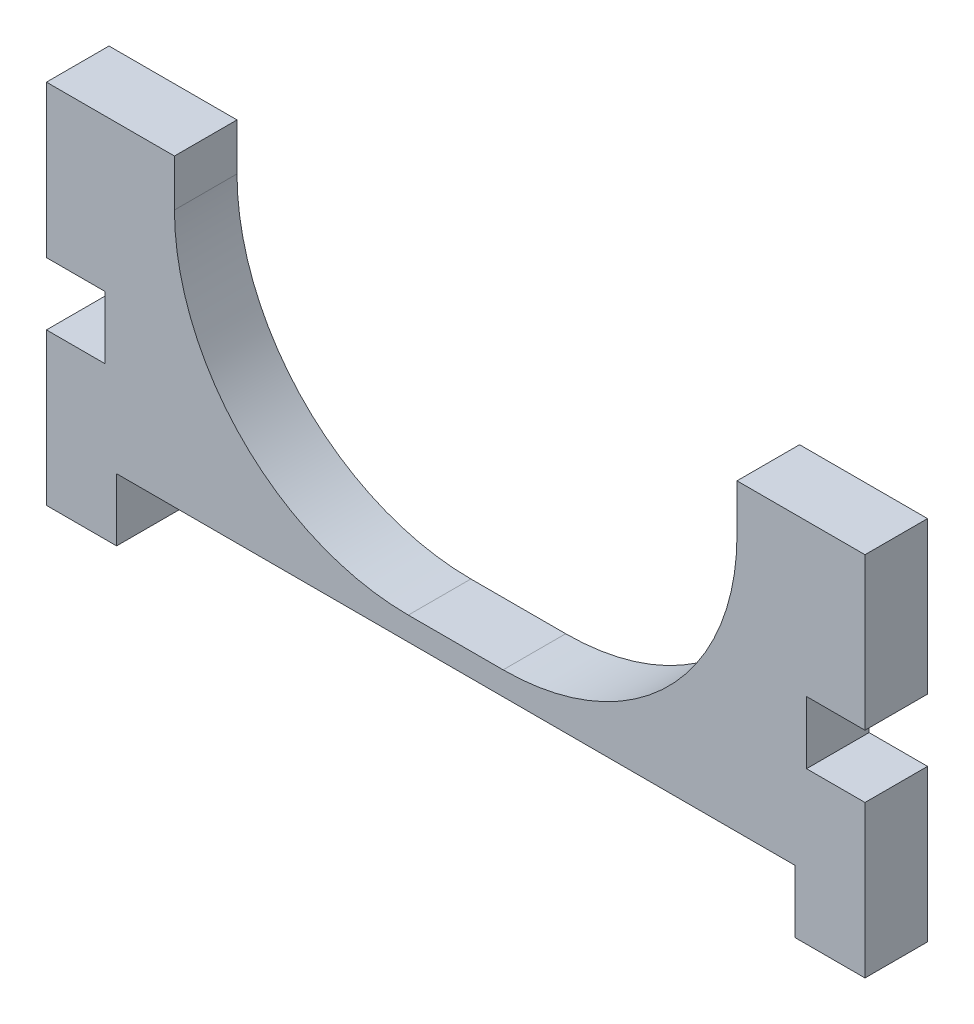
ISO-10303-21;
HEADER;
FILE_DESCRIPTION(('STEP AP214'),'2;1');
FILE_NAME('part.step','',(''),(''),'','','');
FILE_SCHEMA(('AUTOMOTIVE_DESIGN { 1 0 10303 214 1 1 1 1 }'));
ENDSEC;
DATA;
#1=APPLICATION_CONTEXT('core data for automotive mechanical design processes');
#2=APPLICATION_PROTOCOL_DEFINITION('international standard','automotive_design',2000,#1);
#3=PRODUCT_CONTEXT('',#1,'mechanical');
#4=PRODUCT('Part','Part','',(#3));
#5=PRODUCT_RELATED_PRODUCT_CATEGORY('part','',(#4));
#6=PRODUCT_DEFINITION_FORMATION('','',#4);
#7=PRODUCT_DEFINITION_CONTEXT('part definition',#1,'design');
#8=PRODUCT_DEFINITION('design','',#6,#7);
#9=PRODUCT_DEFINITION_SHAPE('','',#8);
#10=(LENGTH_UNIT() NAMED_UNIT(*) SI_UNIT(.MILLI.,.METRE.));
#11=(NAMED_UNIT(*) PLANE_ANGLE_UNIT() SI_UNIT($,.RADIAN.));
#12=(NAMED_UNIT(*) SI_UNIT($,.STERADIAN.) SOLID_ANGLE_UNIT());
#13=UNCERTAINTY_MEASURE_WITH_UNIT(LENGTH_MEASURE(1.E-05),#10,'distance_accuracy_value','');
#14=(GEOMETRIC_REPRESENTATION_CONTEXT(3) GLOBAL_UNCERTAINTY_ASSIGNED_CONTEXT((#13)) GLOBAL_UNIT_ASSIGNED_CONTEXT((#10,
#11,#12)) REPRESENTATION_CONTEXT('',''));
#15=CARTESIAN_POINT('',(0.,0.,0.));
#16=DIRECTION('',(0.,0.,1.));
#17=DIRECTION('',(1.,0.,0.));
#18=AXIS2_PLACEMENT_3D('',#15,#16,#17);
#19=CARTESIAN_POINT('',(-35.,-5.35,5.35));
#20=DIRECTION('',(0.,1.,0.));
#21=DIRECTION('',(0.,0.,1.));
#22=AXIS2_PLACEMENT_3D('',#19,#20,#21);
#23=PLANE('',#22);
#24=DIRECTION('',(1.,0.,0.));
#25=VECTOR('',#24,1.);
#26=CARTESIAN_POINT('',(-35.,-5.35,0.));
#27=LINE('',#26,#25);
#28=CARTESIAN_POINT('',(-35.,-5.35,0.));
#29=VERTEX_POINT('',#28);
#30=CARTESIAN_POINT('',(-29.,-5.35,0.));
#31=VERTEX_POINT('',#30);
#32=EDGE_CURVE('E217',#29,#31,#27,.T.);
#33=ORIENTED_EDGE('',*,*,#32,.T.);
#34=DIRECTION('',(0.,0.,-1.));
#35=VECTOR('',#34,1.);
#36=CARTESIAN_POINT('',(-29.,-5.35,5.35));
#37=LINE('',#36,#35);
#38=CARTESIAN_POINT('',(-29.,-5.35,5.35));
#39=VERTEX_POINT('',#38);
#40=EDGE_CURVE('E41',#39,#31,#37,.T.);
#41=ORIENTED_EDGE('',*,*,#40,.F.);
#42=DIRECTION('',(1.,0.,0.));
#43=VECTOR('',#42,1.);
#44=CARTESIAN_POINT('',(-35.,-5.35,5.35));
#45=LINE('',#44,#43);
#46=CARTESIAN_POINT('',(-35.,-5.35,5.35));
#47=VERTEX_POINT('',#46);
#48=EDGE_CURVE('E135',#47,#39,#45,.T.);
#49=ORIENTED_EDGE('',*,*,#48,.F.);
#50=DIRECTION('',(0.,0.,-1.));
#51=VECTOR('',#50,1.);
#52=CARTESIAN_POINT('',(-35.,-5.35,5.35));
#53=LINE('',#52,#51);
#54=EDGE_CURVE('E11',#47,#29,#53,.T.);
#55=ORIENTED_EDGE('',*,*,#54,.T.);
#56=EDGE_LOOP('',(#33,#41,#49,#55));
#57=FACE_BOUND('',#56,.T.);
#58=ADVANCED_FACE('F33',(#57),#23,.F.);
#59=CARTESIAN_POINT('',(-29.,0.,5.35));
#60=DIRECTION('',(-1.,0.,0.));
#61=DIRECTION('',(0.,0.,1.));
#62=AXIS2_PLACEMENT_3D('',#59,#60,#61);
#63=PLANE('',#62);
#64=DIRECTION('',(0.,1.,0.));
#65=VECTOR('',#64,1.);
#66=CARTESIAN_POINT('',(-29.,0.,0.));
#67=LINE('',#66,#65);
#68=CARTESIAN_POINT('',(-29.,0.,0.));
#69=VERTEX_POINT('',#68);
#70=EDGE_CURVE('E219',#31,#69,#67,.T.);
#71=ORIENTED_EDGE('',*,*,#70,.T.);
#72=DIRECTION('',(0.,0.,-1.));
#73=VECTOR('',#72,1.);
#74=CARTESIAN_POINT('',(-29.,0.,5.35));
#75=LINE('',#74,#73);
#76=CARTESIAN_POINT('',(-29.,0.,5.35));
#77=VERTEX_POINT('',#76);
#78=EDGE_CURVE('E307',#77,#69,#75,.T.);
#79=ORIENTED_EDGE('',*,*,#78,.F.);
#80=DIRECTION('',(0.,1.,0.));
#81=VECTOR('',#80,1.);
#82=CARTESIAN_POINT('',(-29.,0.,5.35));
#83=LINE('',#82,#81);
#84=EDGE_CURVE('E315',#39,#77,#83,.T.);
#85=ORIENTED_EDGE('',*,*,#84,.F.);
#86=ORIENTED_EDGE('',*,*,#40,.T.);
#87=EDGE_LOOP('',(#71,#79,#85,#86));
#88=FACE_BOUND('',#87,.T.);
#89=ADVANCED_FACE('F313',(#88),#63,.F.);
#90=CARTESIAN_POINT('',(-29.,0.,5.35));
#91=DIRECTION('',(0.,1.,0.));
#92=DIRECTION('',(0.,0.,1.));
#93=AXIS2_PLACEMENT_3D('',#90,#91,#92);
#94=PLANE('',#93);
#95=DIRECTION('',(1.,0.,0.));
#96=VECTOR('',#95,1.);
#97=CARTESIAN_POINT('',(-29.,0.,0.));
#98=LINE('',#97,#96);
#99=CARTESIAN_POINT('',(29.,0.,0.));
#100=VERTEX_POINT('',#99);
#101=EDGE_CURVE('E221',#69,#100,#98,.T.);
#102=ORIENTED_EDGE('',*,*,#101,.T.);
#103=DIRECTION('',(0.,0.,-1.));
#104=VECTOR('',#103,1.);
#105=CARTESIAN_POINT('',(29.,0.,5.35));
#106=LINE('',#105,#104);
#107=CARTESIAN_POINT('',(29.,0.,5.35));
#108=VERTEX_POINT('',#107);
#109=EDGE_CURVE('E304',#108,#100,#106,.T.);
#110=ORIENTED_EDGE('',*,*,#109,.F.);
#111=DIRECTION('',(1.,0.,0.));
#112=VECTOR('',#111,1.);
#113=CARTESIAN_POINT('',(-29.,0.,5.35));
#114=LINE('',#113,#112);
#115=EDGE_CURVE('E334',#77,#108,#114,.T.);
#116=ORIENTED_EDGE('',*,*,#115,.F.);
#117=ORIENTED_EDGE('',*,*,#78,.T.);
#118=EDGE_LOOP('',(#102,#110,#116,#117));
#119=FACE_BOUND('',#118,.T.);
#120=ADVANCED_FACE('F325',(#119),#94,.F.);
#121=CARTESIAN_POINT('',(29.,0.,5.35));
#122=DIRECTION('',(1.,0.,0.));
#123=DIRECTION('',(0.,0.,-1.));
#124=AXIS2_PLACEMENT_3D('',#121,#122,#123);
#125=PLANE('',#124);
#126=DIRECTION('',(0.,-1.,0.));
#127=VECTOR('',#126,1.);
#128=CARTESIAN_POINT('',(29.,0.,0.));
#129=LINE('',#128,#127);
#130=CARTESIAN_POINT('',(29.,-5.35,0.));
#131=VERTEX_POINT('',#130);
#132=EDGE_CURVE('E223',#100,#131,#129,.T.);
#133=ORIENTED_EDGE('',*,*,#132,.T.);
#134=DIRECTION('',(0.,0.,-1.));
#135=VECTOR('',#134,1.);
#136=CARTESIAN_POINT('',(29.,-5.35,5.35));
#137=LINE('',#136,#135);
#138=CARTESIAN_POINT('',(29.,-5.35,5.35));
#139=VERTEX_POINT('',#138);
#140=EDGE_CURVE('E301',#139,#131,#137,.T.);
#141=ORIENTED_EDGE('',*,*,#140,.F.);
#142=DIRECTION('',(0.,-1.,0.));
#143=VECTOR('',#142,1.);
#144=CARTESIAN_POINT('',(29.,0.,5.35));
#145=LINE('',#144,#143);
#146=EDGE_CURVE('E331',#108,#139,#145,.T.);
#147=ORIENTED_EDGE('',*,*,#146,.F.);
#148=ORIENTED_EDGE('',*,*,#109,.T.);
#149=EDGE_LOOP('',(#133,#141,#147,#148));
#150=FACE_BOUND('',#149,.T.);
#151=ADVANCED_FACE('F329',(#150),#125,.F.);
#152=CARTESIAN_POINT('',(35.,-5.35,5.35));
#153=DIRECTION('',(0.,1.,0.));
#154=DIRECTION('',(0.,0.,1.));
#155=AXIS2_PLACEMENT_3D('',#152,#153,#154);
#156=PLANE('',#155);
#157=DIRECTION('',(1.,0.,0.));
#158=VECTOR('',#157,1.);
#159=CARTESIAN_POINT('',(35.,-5.35,0.));
#160=LINE('',#159,#158);
#161=CARTESIAN_POINT('',(35.,-5.35,0.));
#162=VERTEX_POINT('',#161);
#163=EDGE_CURVE('E225',#131,#162,#160,.T.);
#164=ORIENTED_EDGE('',*,*,#163,.T.);
#165=DIRECTION('',(0.,0.,-1.));
#166=VECTOR('',#165,1.);
#167=CARTESIAN_POINT('',(35.,-5.35,5.35));
#168=LINE('',#167,#166);
#169=CARTESIAN_POINT('',(35.,-5.35,5.35));
#170=VERTEX_POINT('',#169);
#171=EDGE_CURVE('E298',#170,#162,#168,.T.);
#172=ORIENTED_EDGE('',*,*,#171,.F.);
#173=DIRECTION('',(1.,0.,0.));
#174=VECTOR('',#173,1.);
#175=CARTESIAN_POINT('',(35.,-5.35,5.35));
#176=LINE('',#175,#174);
#177=EDGE_CURVE('E333',#139,#170,#176,.T.);
#178=ORIENTED_EDGE('',*,*,#177,.F.);
#179=ORIENTED_EDGE('',*,*,#140,.T.);
#180=EDGE_LOOP('',(#164,#172,#178,#179));
#181=FACE_BOUND('',#180,.T.);
#182=ADVANCED_FACE('F396',(#181),#156,.F.);
#183=CARTESIAN_POINT('',(35.,-2.50087083037484,5.35));
#184=DIRECTION('',(-1.,0.,0.));
#185=DIRECTION('',(0.,0.,1.));
#186=AXIS2_PLACEMENT_3D('',#183,#184,#185);
#187=PLANE('',#186);
#188=DIRECTION('',(0.,1.,0.));
#189=VECTOR('',#188,1.);
#190=CARTESIAN_POINT('',(35.,-2.50087083037484,0.));
#191=LINE('',#190,#189);
#192=CARTESIAN_POINT('',(35.,7.65,0.));
#193=VERTEX_POINT('',#192);
#194=EDGE_CURVE('E228',#162,#193,#191,.T.);
#195=ORIENTED_EDGE('',*,*,#194,.T.);
#196=DIRECTION('',(0.,0.,-1.));
#197=VECTOR('',#196,1.);
#198=CARTESIAN_POINT('',(35.,7.65,5.35));
#199=LINE('',#198,#197);
#200=CARTESIAN_POINT('',(35.,7.65,5.35));
#201=VERTEX_POINT('',#200);
#202=EDGE_CURVE('E295',#201,#193,#199,.T.);
#203=ORIENTED_EDGE('',*,*,#202,.F.);
#204=DIRECTION('',(0.,1.,0.));
#205=VECTOR('',#204,1.);
#206=CARTESIAN_POINT('',(35.,-2.50087083037484,5.35));
#207=LINE('',#206,#205);
#208=EDGE_CURVE('E336',#170,#201,#207,.T.);
#209=ORIENTED_EDGE('',*,*,#208,.F.);
#210=ORIENTED_EDGE('',*,*,#171,.T.);
#211=EDGE_LOOP('',(#195,#203,#209,#210));
#212=FACE_BOUND('',#211,.T.);
#213=ADVANCED_FACE('F399',(#212),#187,.F.);
#214=CARTESIAN_POINT('',(35.,7.65,5.35));
#215=DIRECTION('',(0.,-1.,0.));
#216=DIRECTION('',(0.,0.,-1.));
#217=AXIS2_PLACEMENT_3D('',#214,#215,#216);
#218=PLANE('',#217);
#219=DIRECTION('',(-1.,0.,0.));
#220=VECTOR('',#219,1.);
#221=CARTESIAN_POINT('',(35.,7.65,0.));
#222=LINE('',#221,#220);
#223=CARTESIAN_POINT('',(30.,7.65,0.));
#224=VERTEX_POINT('',#223);
#225=EDGE_CURVE('E230',#193,#224,#222,.T.);
#226=ORIENTED_EDGE('',*,*,#225,.T.);
#227=DIRECTION('',(0.,0.,-1.));
#228=VECTOR('',#227,1.);
#229=CARTESIAN_POINT('',(30.,7.65,5.35));
#230=LINE('',#229,#228);
#231=CARTESIAN_POINT('',(30.,7.65,5.35));
#232=VERTEX_POINT('',#231);
#233=EDGE_CURVE('E292',#232,#224,#230,.T.);
#234=ORIENTED_EDGE('',*,*,#233,.F.);
#235=DIRECTION('',(-1.,0.,0.));
#236=VECTOR('',#235,1.);
#237=CARTESIAN_POINT('',(35.,7.65,5.35));
#238=LINE('',#237,#236);
#239=EDGE_CURVE('E342',#201,#232,#238,.T.);
#240=ORIENTED_EDGE('',*,*,#239,.F.);
#241=ORIENTED_EDGE('',*,*,#202,.T.);
#242=EDGE_LOOP('',(#226,#234,#240,#241));
#243=FACE_BOUND('',#242,.T.);
#244=ADVANCED_FACE('F403',(#243),#218,.F.);
#245=CARTESIAN_POINT('',(30.,13.,5.35));
#246=DIRECTION('',(-1.,0.,0.));
#247=DIRECTION('',(0.,-1.,0.));
#248=AXIS2_PLACEMENT_3D('',#245,#246,#247);
#249=PLANE('',#248);
#250=DIRECTION('',(0.,1.,0.));
#251=VECTOR('',#250,1.);
#252=CARTESIAN_POINT('',(30.,13.,0.));
#253=LINE('',#252,#251);
#254=CARTESIAN_POINT('',(30.,13.,0.));
#255=VERTEX_POINT('',#254);
#256=EDGE_CURVE('E232',#224,#255,#253,.T.);
#257=ORIENTED_EDGE('',*,*,#256,.T.);
#258=DIRECTION('',(0.,0.,-1.));
#259=VECTOR('',#258,1.);
#260=CARTESIAN_POINT('',(30.,13.,5.35));
#261=LINE('',#260,#259);
#262=CARTESIAN_POINT('',(30.,13.,5.35));
#263=VERTEX_POINT('',#262);
#264=EDGE_CURVE('E289',#263,#255,#261,.T.);
#265=ORIENTED_EDGE('',*,*,#264,.F.);
#266=DIRECTION('',(0.,1.,0.));
#267=VECTOR('',#266,1.);
#268=CARTESIAN_POINT('',(30.,13.,5.35));
#269=LINE('',#268,#267);
#270=EDGE_CURVE('E344',#232,#263,#269,.T.);
#271=ORIENTED_EDGE('',*,*,#270,.F.);
#272=ORIENTED_EDGE('',*,*,#233,.T.);
#273=EDGE_LOOP('',(#257,#265,#271,#272));
#274=FACE_BOUND('',#273,.T.);
#275=ADVANCED_FACE('F407',(#274),#249,.F.);
#276=CARTESIAN_POINT('',(35.,13.,5.35));
#277=DIRECTION('',(0.,1.,0.));
#278=DIRECTION('',(0.,0.,1.));
#279=AXIS2_PLACEMENT_3D('',#276,#277,#278);
#280=PLANE('',#279);
#281=DIRECTION('',(1.,0.,0.));
#282=VECTOR('',#281,1.);
#283=CARTESIAN_POINT('',(35.,13.,0.));
#284=LINE('',#283,#282);
#285=CARTESIAN_POINT('',(35.,13.,0.));
#286=VERTEX_POINT('',#285);
#287=EDGE_CURVE('E234',#255,#286,#284,.T.);
#288=ORIENTED_EDGE('',*,*,#287,.T.);
#289=DIRECTION('',(0.,0.,-1.));
#290=VECTOR('',#289,1.);
#291=CARTESIAN_POINT('',(35.,13.,5.35));
#292=LINE('',#291,#290);
#293=CARTESIAN_POINT('',(35.,13.,5.35));
#294=VERTEX_POINT('',#293);
#295=EDGE_CURVE('E286',#294,#286,#292,.T.);
#296=ORIENTED_EDGE('',*,*,#295,.F.);
#297=DIRECTION('',(1.,0.,0.));
#298=VECTOR('',#297,1.);
#299=CARTESIAN_POINT('',(35.,13.,5.35));
#300=LINE('',#299,#298);
#301=EDGE_CURVE('E346',#263,#294,#300,.T.);
#302=ORIENTED_EDGE('',*,*,#301,.F.);
#303=ORIENTED_EDGE('',*,*,#264,.T.);
#304=EDGE_LOOP('',(#288,#296,#302,#303));
#305=FACE_BOUND('',#304,.T.);
#306=ADVANCED_FACE('F411',(#305),#280,.F.);
#307=CARTESIAN_POINT('',(35.,13.,5.35));
#308=DIRECTION('',(-1.,0.,0.));
#309=DIRECTION('',(0.,0.,1.));
#310=AXIS2_PLACEMENT_3D('',#307,#308,#309);
#311=PLANE('',#310);
#312=DIRECTION('',(0.,1.,0.));
#313=VECTOR('',#312,1.);
#314=CARTESIAN_POINT('',(35.,13.,0.));
#315=LINE('',#314,#313);
#316=CARTESIAN_POINT('',(35.,26.,0.));
#317=VERTEX_POINT('',#316);
#318=EDGE_CURVE('E236',#286,#317,#315,.T.);
#319=ORIENTED_EDGE('',*,*,#318,.T.);
#320=DIRECTION('',(0.,0.,-1.));
#321=VECTOR('',#320,1.);
#322=CARTESIAN_POINT('',(35.,26.,5.35));
#323=LINE('',#322,#321);
#324=CARTESIAN_POINT('',(35.,26.,5.35));
#325=VERTEX_POINT('',#324);
#326=EDGE_CURVE('E283',#325,#317,#323,.T.);
#327=ORIENTED_EDGE('',*,*,#326,.F.);
#328=DIRECTION('',(0.,1.,0.));
#329=VECTOR('',#328,1.);
#330=CARTESIAN_POINT('',(35.,13.,5.35));
#331=LINE('',#330,#329);
#332=EDGE_CURVE('E348',#294,#325,#331,.T.);
#333=ORIENTED_EDGE('',*,*,#332,.F.);
#334=ORIENTED_EDGE('',*,*,#295,.T.);
#335=EDGE_LOOP('',(#319,#327,#333,#334));
#336=FACE_BOUND('',#335,.T.);
#337=ADVANCED_FACE('F415',(#336),#311,.F.);
#338=CARTESIAN_POINT('',(24.055,26.,5.35));
#339=DIRECTION('',(0.,-1.,0.));
#340=DIRECTION('',(1.,0.,0.));
#341=AXIS2_PLACEMENT_3D('',#338,#339,#340);
#342=PLANE('',#341);
#343=DIRECTION('',(-1.,0.,0.));
#344=VECTOR('',#343,1.);
#345=CARTESIAN_POINT('',(24.055,26.,0.));
#346=LINE('',#345,#344);
#347=CARTESIAN_POINT('',(24.055,26.,0.));
#348=VERTEX_POINT('',#347);
#349=EDGE_CURVE('E238',#317,#348,#346,.T.);
#350=ORIENTED_EDGE('',*,*,#349,.T.);
#351=DIRECTION('',(0.,0.,-1.));
#352=VECTOR('',#351,1.);
#353=CARTESIAN_POINT('',(24.055,26.,5.35));
#354=LINE('',#353,#352);
#355=CARTESIAN_POINT('',(24.055,26.,5.35));
#356=VERTEX_POINT('',#355);
#357=EDGE_CURVE('E280',#356,#348,#354,.T.);
#358=ORIENTED_EDGE('',*,*,#357,.F.);
#359=DIRECTION('',(-1.,0.,0.));
#360=VECTOR('',#359,1.);
#361=CARTESIAN_POINT('',(24.055,26.,5.35));
#362=LINE('',#361,#360);
#363=EDGE_CURVE('E350',#325,#356,#362,.T.);
#364=ORIENTED_EDGE('',*,*,#363,.F.);
#365=ORIENTED_EDGE('',*,*,#326,.T.);
#366=EDGE_LOOP('',(#350,#358,#364,#365));
#367=FACE_BOUND('',#366,.T.);
#368=ADVANCED_FACE('F419',(#367),#342,.F.);
#369=CARTESIAN_POINT('',(24.055,26.,5.35));
#370=DIRECTION('',(1.,0.,0.));
#371=DIRECTION('',(0.,0.,-1.));
#372=AXIS2_PLACEMENT_3D('',#369,#370,#371);
#373=PLANE('',#372);
#374=DIRECTION('',(0.,-1.,0.));
#375=VECTOR('',#374,1.);
#376=CARTESIAN_POINT('',(24.055,26.,0.));
#377=LINE('',#376,#375);
#378=CARTESIAN_POINT('',(24.055,22.,0.));
#379=VERTEX_POINT('',#378);
#380=EDGE_CURVE('E240',#348,#379,#377,.T.);
#381=ORIENTED_EDGE('',*,*,#380,.T.);
#382=DIRECTION('',(0.,0.,-1.));
#383=VECTOR('',#382,1.);
#384=CARTESIAN_POINT('',(24.055,22.,5.35));
#385=LINE('',#384,#383);
#386=CARTESIAN_POINT('',(24.055,22.,5.35));
#387=VERTEX_POINT('',#386);
#388=EDGE_CURVE('E277',#387,#379,#385,.T.);
#389=ORIENTED_EDGE('',*,*,#388,.F.);
#390=DIRECTION('',(0.,-1.,0.));
#391=VECTOR('',#390,1.);
#392=CARTESIAN_POINT('',(24.055,26.,5.35));
#393=LINE('',#392,#391);
#394=EDGE_CURVE('E352',#356,#387,#393,.T.);
#395=ORIENTED_EDGE('',*,*,#394,.F.);
#396=ORIENTED_EDGE('',*,*,#357,.T.);
#397=EDGE_LOOP('',(#381,#389,#395,#396));
#398=FACE_BOUND('',#397,.T.);
#399=ADVANCED_FACE('F423',(#398),#373,.F.);
#400=CARTESIAN_POINT('',(4.05500000000001,22.,5.35));
#401=DIRECTION('',(0.,0.,-1.));
#402=DIRECTION('',(-1.,0.,0.));
#403=AXIS2_PLACEMENT_3D('',#400,#401,#402);
#404=CYLINDRICAL_SURFACE('',#403,20.);
#405=CARTESIAN_POINT('',(4.05500000000001,22.,0.));
#406=DIRECTION('',(0.,0.,-1.));
#407=DIRECTION('',(-1.,0.,0.));
#408=AXIS2_PLACEMENT_3D('',#405,#406,#407);
#409=CIRCLE('',#408,20.);
#410=CARTESIAN_POINT('',(4.05500000000001,2.,0.));
#411=VERTEX_POINT('',#410);
#412=EDGE_CURVE('E242',#379,#411,#409,.T.);
#413=ORIENTED_EDGE('',*,*,#412,.T.);
#414=DIRECTION('',(0.,0.,-1.));
#415=VECTOR('',#414,1.);
#416=CARTESIAN_POINT('',(4.05500000000001,2.,5.35));
#417=LINE('',#416,#415);
#418=CARTESIAN_POINT('',(4.05500000000001,2.,5.35));
#419=VERTEX_POINT('',#418);
#420=EDGE_CURVE('E274',#419,#411,#417,.T.);
#421=ORIENTED_EDGE('',*,*,#420,.F.);
#422=CARTESIAN_POINT('',(4.05500000000001,22.,5.35));
#423=DIRECTION('',(0.,0.,-1.));
#424=DIRECTION('',(-1.,0.,0.));
#425=AXIS2_PLACEMENT_3D('',#422,#423,#424);
#426=CIRCLE('',#425,20.);
#427=EDGE_CURVE('E354',#387,#419,#426,.T.);
#428=ORIENTED_EDGE('',*,*,#427,.F.);
#429=ORIENTED_EDGE('',*,*,#388,.T.);
#430=EDGE_LOOP('',(#413,#421,#428,#429));
#431=FACE_BOUND('',#430,.T.);
#432=ADVANCED_FACE('F427',(#431),#404,.F.);
#433=CARTESIAN_POINT('',(-4.05500000000001,2.,5.35));
#434=DIRECTION('',(0.,-1.,0.));
#435=DIRECTION('',(0.,0.,-1.));
#436=AXIS2_PLACEMENT_3D('',#433,#434,#435);
#437=PLANE('',#436);
#438=DIRECTION('',(-1.,0.,0.));
#439=VECTOR('',#438,1.);
#440=CARTESIAN_POINT('',(-4.05500000000001,2.,0.));
#441=LINE('',#440,#439);
#442=CARTESIAN_POINT('',(-4.05500000000001,2.,0.));
#443=VERTEX_POINT('',#442);
#444=EDGE_CURVE('E244',#411,#443,#441,.T.);
#445=ORIENTED_EDGE('',*,*,#444,.T.);
#446=DIRECTION('',(0.,0.,-1.));
#447=VECTOR('',#446,1.);
#448=CARTESIAN_POINT('',(-4.05500000000001,2.,5.35));
#449=LINE('',#448,#447);
#450=CARTESIAN_POINT('',(-4.05500000000001,2.,5.35));
#451=VERTEX_POINT('',#450);
#452=EDGE_CURVE('E271',#451,#443,#449,.T.);
#453=ORIENTED_EDGE('',*,*,#452,.F.);
#454=DIRECTION('',(-1.,0.,0.));
#455=VECTOR('',#454,1.);
#456=CARTESIAN_POINT('',(-4.05500000000001,2.,5.35));
#457=LINE('',#456,#455);
#458=EDGE_CURVE('E356',#419,#451,#457,.T.);
#459=ORIENTED_EDGE('',*,*,#458,.F.);
#460=ORIENTED_EDGE('',*,*,#420,.T.);
#461=EDGE_LOOP('',(#445,#453,#459,#460));
#462=FACE_BOUND('',#461,.T.);
#463=ADVANCED_FACE('F431',(#462),#437,.F.);
#464=CARTESIAN_POINT('',(-4.05500000000001,22.,5.35));
#465=DIRECTION('',(0.,0.,-1.));
#466=DIRECTION('',(-1.,0.,0.));
#467=AXIS2_PLACEMENT_3D('',#464,#465,#466);
#468=CYLINDRICAL_SURFACE('',#467,20.);
#469=CARTESIAN_POINT('',(-4.05500000000001,22.,0.));
#470=DIRECTION('',(0.,0.,-1.));
#471=DIRECTION('',(1.,0.,0.));
#472=AXIS2_PLACEMENT_3D('',#469,#470,#471);
#473=CIRCLE('',#472,20.);
#474=CARTESIAN_POINT('',(-24.055,22.,0.));
#475=VERTEX_POINT('',#474);
#476=EDGE_CURVE('E246',#443,#475,#473,.T.);
#477=ORIENTED_EDGE('',*,*,#476,.T.);
#478=DIRECTION('',(0.,0.,-1.));
#479=VECTOR('',#478,1.);
#480=CARTESIAN_POINT('',(-24.055,22.,5.35));
#481=LINE('',#480,#479);
#482=CARTESIAN_POINT('',(-24.055,22.,5.35));
#483=VERTEX_POINT('',#482);
#484=EDGE_CURVE('E268',#483,#475,#481,.T.);
#485=ORIENTED_EDGE('',*,*,#484,.F.);
#486=CARTESIAN_POINT('',(-4.05500000000001,22.,5.35));
#487=DIRECTION('',(0.,0.,-1.));
#488=DIRECTION('',(1.,0.,0.));
#489=AXIS2_PLACEMENT_3D('',#486,#487,#488);
#490=CIRCLE('',#489,20.);
#491=EDGE_CURVE('E358',#451,#483,#490,.T.);
#492=ORIENTED_EDGE('',*,*,#491,.F.);
#493=ORIENTED_EDGE('',*,*,#452,.T.);
#494=EDGE_LOOP('',(#477,#485,#492,#493));
#495=FACE_BOUND('',#494,.T.);
#496=ADVANCED_FACE('F435',(#495),#468,.F.);
#497=CARTESIAN_POINT('',(-24.055,26.,5.35));
#498=DIRECTION('',(-1.,0.,0.));
#499=DIRECTION('',(0.,0.,1.));
#500=AXIS2_PLACEMENT_3D('',#497,#498,#499);
#501=PLANE('',#500);
#502=DIRECTION('',(0.,1.,0.));
#503=VECTOR('',#502,1.);
#504=CARTESIAN_POINT('',(-24.055,26.,0.));
#505=LINE('',#504,#503);
#506=CARTESIAN_POINT('',(-24.055,26.,0.));
#507=VERTEX_POINT('',#506);
#508=EDGE_CURVE('E248',#475,#507,#505,.T.);
#509=ORIENTED_EDGE('',*,*,#508,.T.);
#510=DIRECTION('',(0.,0.,-1.));
#511=VECTOR('',#510,1.);
#512=CARTESIAN_POINT('',(-24.055,26.,5.35));
#513=LINE('',#512,#511);
#514=CARTESIAN_POINT('',(-24.055,26.,5.35));
#515=VERTEX_POINT('',#514);
#516=EDGE_CURVE('E265',#515,#507,#513,.T.);
#517=ORIENTED_EDGE('',*,*,#516,.F.);
#518=DIRECTION('',(0.,1.,0.));
#519=VECTOR('',#518,1.);
#520=CARTESIAN_POINT('',(-24.055,26.,5.35));
#521=LINE('',#520,#519);
#522=EDGE_CURVE('E360',#483,#515,#521,.T.);
#523=ORIENTED_EDGE('',*,*,#522,.F.);
#524=ORIENTED_EDGE('',*,*,#484,.T.);
#525=EDGE_LOOP('',(#509,#517,#523,#524));
#526=FACE_BOUND('',#525,.T.);
#527=ADVANCED_FACE('F439',(#526),#501,.F.);
#528=CARTESIAN_POINT('',(-35.,26.,5.35));
#529=DIRECTION('',(0.,-1.,0.));
#530=DIRECTION('',(1.,0.,0.));
#531=AXIS2_PLACEMENT_3D('',#528,#529,#530);
#532=PLANE('',#531);
#533=DIRECTION('',(-1.,0.,0.));
#534=VECTOR('',#533,1.);
#535=CARTESIAN_POINT('',(-35.,26.,0.));
#536=LINE('',#535,#534);
#537=CARTESIAN_POINT('',(-35.,26.,0.));
#538=VERTEX_POINT('',#537);
#539=EDGE_CURVE('E250',#507,#538,#536,.T.);
#540=ORIENTED_EDGE('',*,*,#539,.T.);
#541=DIRECTION('',(0.,0.,-1.));
#542=VECTOR('',#541,1.);
#543=CARTESIAN_POINT('',(-35.,26.,5.35));
#544=LINE('',#543,#542);
#545=CARTESIAN_POINT('',(-35.,26.,5.35));
#546=VERTEX_POINT('',#545);
#547=EDGE_CURVE('E262',#546,#538,#544,.T.);
#548=ORIENTED_EDGE('',*,*,#547,.F.);
#549=DIRECTION('',(-1.,0.,0.));
#550=VECTOR('',#549,1.);
#551=CARTESIAN_POINT('',(-35.,26.,5.35));
#552=LINE('',#551,#550);
#553=EDGE_CURVE('E362',#515,#546,#552,.T.);
#554=ORIENTED_EDGE('',*,*,#553,.F.);
#555=ORIENTED_EDGE('',*,*,#516,.T.);
#556=EDGE_LOOP('',(#540,#548,#554,#555));
#557=FACE_BOUND('',#556,.T.);
#558=ADVANCED_FACE('F368',(#557),#532,.F.);
#559=CARTESIAN_POINT('',(-35.,13.,5.35));
#560=DIRECTION('',(1.,0.,0.));
#561=DIRECTION('',(0.,0.,-1.));
#562=AXIS2_PLACEMENT_3D('',#559,#560,#561);
#563=PLANE('',#562);
#564=DIRECTION('',(0.,-1.,0.));
#565=VECTOR('',#564,1.);
#566=CARTESIAN_POINT('',(-35.,13.,0.));
#567=LINE('',#566,#565);
#568=CARTESIAN_POINT('',(-35.,13.,0.));
#569=VERTEX_POINT('',#568);
#570=EDGE_CURVE('E252',#538,#569,#567,.T.);
#571=ORIENTED_EDGE('',*,*,#570,.T.);
#572=DIRECTION('',(0.,0.,-1.));
#573=VECTOR('',#572,1.);
#574=CARTESIAN_POINT('',(-35.,13.,5.35));
#575=LINE('',#574,#573);
#576=CARTESIAN_POINT('',(-35.,13.,5.35));
#577=VERTEX_POINT('',#576);
#578=EDGE_CURVE('E206',#577,#569,#575,.T.);
#579=ORIENTED_EDGE('',*,*,#578,.F.);
#580=DIRECTION('',(0.,-1.,0.));
#581=VECTOR('',#580,1.);
#582=CARTESIAN_POINT('',(-35.,13.,5.35));
#583=LINE('',#582,#581);
#584=EDGE_CURVE('E197',#546,#577,#583,.T.);
#585=ORIENTED_EDGE('',*,*,#584,.F.);
#586=ORIENTED_EDGE('',*,*,#547,.T.);
#587=EDGE_LOOP('',(#571,#579,#585,#586));
#588=FACE_BOUND('',#587,.T.);
#589=ADVANCED_FACE('F372',(#588),#563,.F.);
#590=CARTESIAN_POINT('',(-35.,13.,5.35));
#591=DIRECTION('',(0.,1.,0.));
#592=DIRECTION('',(0.,0.,1.));
#593=AXIS2_PLACEMENT_3D('',#590,#591,#592);
#594=PLANE('',#593);
#595=DIRECTION('',(1.,0.,0.));
#596=VECTOR('',#595,1.);
#597=CARTESIAN_POINT('',(-35.,13.,0.));
#598=LINE('',#597,#596);
#599=CARTESIAN_POINT('',(-30.,13.,0.));
#600=VERTEX_POINT('',#599);
#601=EDGE_CURVE('E205',#569,#600,#598,.T.);
#602=ORIENTED_EDGE('',*,*,#601,.T.);
#603=DIRECTION('',(0.,0.,-1.));
#604=VECTOR('',#603,1.);
#605=CARTESIAN_POINT('',(-30.,13.,5.35));
#606=LINE('',#605,#604);
#607=CARTESIAN_POINT('',(-30.,13.,5.35));
#608=VERTEX_POINT('',#607);
#609=EDGE_CURVE('E202',#608,#600,#606,.T.);
#610=ORIENTED_EDGE('',*,*,#609,.F.);
#611=DIRECTION('',(1.,0.,0.));
#612=VECTOR('',#611,1.);
#613=CARTESIAN_POINT('',(-35.,13.,5.35));
#614=LINE('',#613,#612);
#615=EDGE_CURVE('E191',#577,#608,#614,.T.);
#616=ORIENTED_EDGE('',*,*,#615,.F.);
#617=ORIENTED_EDGE('',*,*,#578,.T.);
#618=EDGE_LOOP('',(#602,#610,#616,#617));
#619=FACE_BOUND('',#618,.T.);
#620=ADVANCED_FACE('F203',(#619),#594,.F.);
#621=CARTESIAN_POINT('',(-30.,13.,5.35));
#622=DIRECTION('',(1.,0.,0.));
#623=DIRECTION('',(0.,0.,-1.));
#624=AXIS2_PLACEMENT_3D('',#621,#622,#623);
#625=PLANE('',#624);
#626=DIRECTION('',(0.,-1.,0.));
#627=VECTOR('',#626,1.);
#628=CARTESIAN_POINT('',(-30.,13.,0.));
#629=LINE('',#628,#627);
#630=CARTESIAN_POINT('',(-30.,7.65,0.));
#631=VERTEX_POINT('',#630);
#632=EDGE_CURVE('E121',#600,#631,#629,.T.);
#633=ORIENTED_EDGE('',*,*,#632,.T.);
#634=DIRECTION('',(0.,0.,-1.));
#635=VECTOR('',#634,1.);
#636=CARTESIAN_POINT('',(-30.,7.65,5.35));
#637=LINE('',#636,#635);
#638=CARTESIAN_POINT('',(-30.,7.65,5.35));
#639=VERTEX_POINT('',#638);
#640=EDGE_CURVE('E207',#639,#631,#637,.T.);
#641=ORIENTED_EDGE('',*,*,#640,.F.);
#642=DIRECTION('',(0.,-1.,0.));
#643=VECTOR('',#642,1.);
#644=CARTESIAN_POINT('',(-30.,13.,5.35));
#645=LINE('',#644,#643);
#646=EDGE_CURVE('E195',#608,#639,#645,.T.);
#647=ORIENTED_EDGE('',*,*,#646,.F.);
#648=ORIENTED_EDGE('',*,*,#609,.T.);
#649=EDGE_LOOP('',(#633,#641,#647,#648));
#650=FACE_BOUND('',#649,.T.);
#651=ADVANCED_FACE('F209',(#650),#625,.F.);
#652=CARTESIAN_POINT('',(-35.,7.65,5.35));
#653=DIRECTION('',(0.,-1.,0.));
#654=DIRECTION('',(0.,0.,-1.));
#655=AXIS2_PLACEMENT_3D('',#652,#653,#654);
#656=PLANE('',#655);
#657=DIRECTION('',(-1.,0.,0.));
#658=VECTOR('',#657,1.);
#659=CARTESIAN_POINT('',(-35.,7.65,0.));
#660=LINE('',#659,#658);
#661=CARTESIAN_POINT('',(-35.,7.65,0.));
#662=VERTEX_POINT('',#661);
#663=EDGE_CURVE('E128',#631,#662,#660,.T.);
#664=ORIENTED_EDGE('',*,*,#663,.T.);
#665=DIRECTION('',(0.,0.,-1.));
#666=VECTOR('',#665,1.);
#667=CARTESIAN_POINT('',(-35.,7.65,5.35));
#668=LINE('',#667,#666);
#669=CARTESIAN_POINT('',(-35.,7.65,5.35));
#670=VERTEX_POINT('',#669);
#671=EDGE_CURVE('E213',#670,#662,#668,.T.);
#672=ORIENTED_EDGE('',*,*,#671,.F.);
#673=DIRECTION('',(-1.,0.,0.));
#674=VECTOR('',#673,1.);
#675=CARTESIAN_POINT('',(-35.,7.65,5.35));
#676=LINE('',#675,#674);
#677=EDGE_CURVE('E211',#639,#670,#676,.T.);
#678=ORIENTED_EDGE('',*,*,#677,.F.);
#679=ORIENTED_EDGE('',*,*,#640,.T.);
#680=EDGE_LOOP('',(#664,#672,#678,#679));
#681=FACE_BOUND('',#680,.T.);
#682=ADVANCED_FACE('F374',(#681),#656,.F.);
#683=CARTESIAN_POINT('',(-35.,-2.50087083037484,5.35));
#684=DIRECTION('',(1.,0.,0.));
#685=DIRECTION('',(0.,0.,-1.));
#686=AXIS2_PLACEMENT_3D('',#683,#684,#685);
#687=PLANE('',#686);
#688=DIRECTION('',(0.,-1.,0.));
#689=VECTOR('',#688,1.);
#690=CARTESIAN_POINT('',(-35.,-2.50087083037484,0.));
#691=LINE('',#690,#689);
#692=EDGE_CURVE('E257',#662,#29,#691,.T.);
#693=ORIENTED_EDGE('',*,*,#692,.T.);
#694=ORIENTED_EDGE('',*,*,#54,.F.);
#695=DIRECTION('',(0.,-1.,0.));
#696=VECTOR('',#695,1.);
#697=CARTESIAN_POINT('',(-35.,-2.50087083037484,5.35));
#698=LINE('',#697,#696);
#699=EDGE_CURVE('E49',#670,#47,#698,.T.);
#700=ORIENTED_EDGE('',*,*,#699,.F.);
#701=ORIENTED_EDGE('',*,*,#671,.T.);
#702=EDGE_LOOP('',(#693,#694,#700,#701));
#703=FACE_BOUND('',#702,.T.);
#704=ADVANCED_FACE('F373',(#703),#687,.F.);
#705=CARTESIAN_POINT('',(4.05500000000001,22.,5.35));
#706=DIRECTION('',(0.,0.,-1.));
#707=DIRECTION('',(-1.,0.,0.));
#708=AXIS2_PLACEMENT_3D('',#705,#706,#707);
#709=PLANE('',#708);
#710=ORIENTED_EDGE('',*,*,#699,.T.);
#711=ORIENTED_EDGE('',*,*,#48,.T.);
#712=ORIENTED_EDGE('',*,*,#84,.T.);
#713=ORIENTED_EDGE('',*,*,#115,.T.);
#714=ORIENTED_EDGE('',*,*,#146,.T.);
#715=ORIENTED_EDGE('',*,*,#177,.T.);
#716=ORIENTED_EDGE('',*,*,#208,.T.);
#717=ORIENTED_EDGE('',*,*,#239,.T.);
#718=ORIENTED_EDGE('',*,*,#270,.T.);
#719=ORIENTED_EDGE('',*,*,#301,.T.);
#720=ORIENTED_EDGE('',*,*,#332,.T.);
#721=ORIENTED_EDGE('',*,*,#363,.T.);
#722=ORIENTED_EDGE('',*,*,#394,.T.);
#723=ORIENTED_EDGE('',*,*,#427,.T.);
#724=ORIENTED_EDGE('',*,*,#458,.T.);
#725=ORIENTED_EDGE('',*,*,#491,.T.);
#726=ORIENTED_EDGE('',*,*,#522,.T.);
#727=ORIENTED_EDGE('',*,*,#553,.T.);
#728=ORIENTED_EDGE('',*,*,#584,.T.);
#729=ORIENTED_EDGE('',*,*,#615,.T.);
#730=ORIENTED_EDGE('',*,*,#646,.T.);
#731=ORIENTED_EDGE('',*,*,#677,.T.);
#732=EDGE_LOOP('',(#710,#711,#712,#713,#714,#715,#716,#717,#718,#719,#720,#721,#722,#723,#724,
#725,#726,#727,#728,#729,#730,#731));
#733=FACE_BOUND('',#732,.T.);
#734=ADVANCED_FACE('F193',(#733),#709,.F.);
#735=CARTESIAN_POINT('',(4.05500000000001,22.,0.));
#736=DIRECTION('',(0.,0.,-1.));
#737=DIRECTION('',(-1.,0.,0.));
#738=AXIS2_PLACEMENT_3D('',#735,#736,#737);
#739=PLANE('',#738);
#740=ORIENTED_EDGE('',*,*,#32,.F.);
#741=ORIENTED_EDGE('',*,*,#692,.F.);
#742=ORIENTED_EDGE('',*,*,#663,.F.);
#743=ORIENTED_EDGE('',*,*,#632,.F.);
#744=ORIENTED_EDGE('',*,*,#601,.F.);
#745=ORIENTED_EDGE('',*,*,#570,.F.);
#746=ORIENTED_EDGE('',*,*,#539,.F.);
#747=ORIENTED_EDGE('',*,*,#508,.F.);
#748=ORIENTED_EDGE('',*,*,#476,.F.);
#749=ORIENTED_EDGE('',*,*,#444,.F.);
#750=ORIENTED_EDGE('',*,*,#412,.F.);
#751=ORIENTED_EDGE('',*,*,#380,.F.);
#752=ORIENTED_EDGE('',*,*,#349,.F.);
#753=ORIENTED_EDGE('',*,*,#318,.F.);
#754=ORIENTED_EDGE('',*,*,#287,.F.);
#755=ORIENTED_EDGE('',*,*,#256,.F.);
#756=ORIENTED_EDGE('',*,*,#225,.F.);
#757=ORIENTED_EDGE('',*,*,#194,.F.);
#758=ORIENTED_EDGE('',*,*,#163,.F.);
#759=ORIENTED_EDGE('',*,*,#132,.F.);
#760=ORIENTED_EDGE('',*,*,#101,.F.);
#761=ORIENTED_EDGE('',*,*,#70,.F.);
#762=EDGE_LOOP('',(#740,#741,#742,#743,#744,#745,#746,#747,#748,#749,#750,#751,#752,#753,#754,
#755,#756,#757,#758,#759,#760,#761));
#763=FACE_BOUND('',#762,.T.);
#764=ADVANCED_FACE('F319',(#763),#739,.T.);
#765=CLOSED_SHELL('',(#58,#89,#120,#151,#182,#213,#244,#275,#306,#337,#368,#399,#432,#463,#496,
#527,#558,#589,#620,#651,#682,#704,#734,#764));
#766=MANIFOLD_SOLID_BREP('B2',#765);
#767=ADVANCED_BREP_SHAPE_REPRESENTATION('',(#18,#766),#14);
#768=SHAPE_DEFINITION_REPRESENTATION(#9,#767);
ENDSEC;
END-ISO-10303-21;
